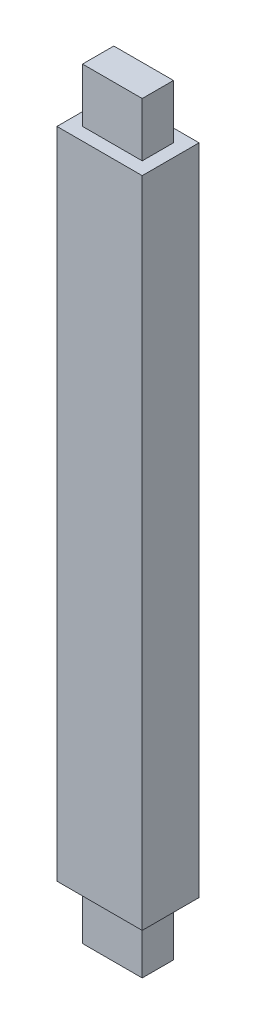
ISO-10303-21;
HEADER;
FILE_DESCRIPTION(('STEP AP214'),'2;1');
FILE_NAME('part.step','',(''),(''),'','','');
FILE_SCHEMA(('AUTOMOTIVE_DESIGN { 1 0 10303 214 1 1 1 1 }'));
ENDSEC;
DATA;
#1=APPLICATION_CONTEXT('core data for automotive mechanical design processes');
#2=APPLICATION_PROTOCOL_DEFINITION('international standard','automotive_design',2000,#1);
#3=PRODUCT_CONTEXT('',#1,'mechanical');
#4=PRODUCT('Part','Part','',(#3));
#5=PRODUCT_RELATED_PRODUCT_CATEGORY('part','',(#4));
#6=PRODUCT_DEFINITION_FORMATION('','',#4);
#7=PRODUCT_DEFINITION_CONTEXT('part definition',#1,'design');
#8=PRODUCT_DEFINITION('design','',#6,#7);
#9=PRODUCT_DEFINITION_SHAPE('','',#8);
#10=(LENGTH_UNIT() NAMED_UNIT(*) SI_UNIT(.MILLI.,.METRE.));
#11=(NAMED_UNIT(*) PLANE_ANGLE_UNIT() SI_UNIT($,.RADIAN.));
#12=(NAMED_UNIT(*) SI_UNIT($,.STERADIAN.) SOLID_ANGLE_UNIT());
#13=UNCERTAINTY_MEASURE_WITH_UNIT(LENGTH_MEASURE(1.E-05),#10,'distance_accuracy_value','');
#14=(GEOMETRIC_REPRESENTATION_CONTEXT(3) GLOBAL_UNCERTAINTY_ASSIGNED_CONTEXT((#13)) GLOBAL_UNIT_ASSIGNED_CONTEXT((#10,
#11,#12)) REPRESENTATION_CONTEXT('',''));
#15=CARTESIAN_POINT('',(0.,0.,0.));
#16=DIRECTION('',(0.,0.,1.));
#17=DIRECTION('',(1.,0.,0.));
#18=AXIS2_PLACEMENT_3D('',#15,#16,#17);
#19=CARTESIAN_POINT('',(7.5,57.5,-5.));
#20=DIRECTION('',(-1.,0.,0.));
#21=DIRECTION('',(0.,0.,1.));
#22=AXIS2_PLACEMENT_3D('',#19,#20,#21);
#23=PLANE('',#22);
#24=DIRECTION('',(0.,0.,-1.));
#25=VECTOR('',#24,1.);
#26=CARTESIAN_POINT('',(7.5,-57.5,-5.));
#27=LINE('',#26,#25);
#28=CARTESIAN_POINT('',(7.5,-57.5,5.));
#29=VERTEX_POINT('',#28);
#30=CARTESIAN_POINT('',(7.5,-57.5,-5.));
#31=VERTEX_POINT('',#30);
#32=EDGE_CURVE('E195',#29,#31,#27,.T.);
#33=ORIENTED_EDGE('',*,*,#32,.T.);
#34=DIRECTION('',(0.,-1.,0.));
#35=VECTOR('',#34,1.);
#36=CARTESIAN_POINT('',(7.5,57.5,-5.));
#37=LINE('',#36,#35);
#38=CARTESIAN_POINT('',(7.5,57.5,-5.));
#39=VERTEX_POINT('',#38);
#40=EDGE_CURVE('E11',#39,#31,#37,.T.);
#41=ORIENTED_EDGE('',*,*,#40,.F.);
#42=DIRECTION('',(0.,0.,-1.));
#43=VECTOR('',#42,1.);
#44=CARTESIAN_POINT('',(7.5,57.5,-5.));
#45=LINE('',#44,#43);
#46=CARTESIAN_POINT('',(7.5,57.5,5.));
#47=VERTEX_POINT('',#46);
#48=EDGE_CURVE('E196',#47,#39,#45,.T.);
#49=ORIENTED_EDGE('',*,*,#48,.F.);
#50=DIRECTION('',(0.,-1.,0.));
#51=VECTOR('',#50,1.);
#52=CARTESIAN_POINT('',(7.5,57.5,5.));
#53=LINE('',#52,#51);
#54=EDGE_CURVE('E206',#47,#29,#53,.T.);
#55=ORIENTED_EDGE('',*,*,#54,.T.);
#56=EDGE_LOOP('',(#33,#41,#49,#55));
#57=FACE_BOUND('',#56,.T.);
#58=ADVANCED_FACE('F39',(#57),#23,.F.);
#59=CARTESIAN_POINT('',(-7.5,57.5,-5.));
#60=DIRECTION('',(0.,0.,1.));
#61=DIRECTION('',(1.,0.,0.));
#62=AXIS2_PLACEMENT_3D('',#59,#60,#61);
#63=PLANE('',#62);
#64=DIRECTION('',(-1.,0.,0.));
#65=VECTOR('',#64,1.);
#66=CARTESIAN_POINT('',(-7.5,-57.5,-5.));
#67=LINE('',#66,#65);
#68=CARTESIAN_POINT('',(-7.5,-57.5,-5.));
#69=VERTEX_POINT('',#68);
#70=EDGE_CURVE('E209',#31,#69,#67,.T.);
#71=ORIENTED_EDGE('',*,*,#70,.T.);
#72=DIRECTION('',(0.,-1.,0.));
#73=VECTOR('',#72,1.);
#74=CARTESIAN_POINT('',(-7.5,57.5,-5.));
#75=LINE('',#74,#73);
#76=CARTESIAN_POINT('',(-7.5,57.5,-5.));
#77=VERTEX_POINT('',#76);
#78=EDGE_CURVE('E46',#77,#69,#75,.T.);
#79=ORIENTED_EDGE('',*,*,#78,.F.);
#80=DIRECTION('',(-1.,0.,0.));
#81=VECTOR('',#80,1.);
#82=CARTESIAN_POINT('',(-7.5,57.5,-5.));
#83=LINE('',#82,#81);
#84=EDGE_CURVE('E199',#39,#77,#83,.T.);
#85=ORIENTED_EDGE('',*,*,#84,.F.);
#86=ORIENTED_EDGE('',*,*,#40,.T.);
#87=EDGE_LOOP('',(#71,#79,#85,#86));
#88=FACE_BOUND('',#87,.T.);
#89=ADVANCED_FACE('F239',(#88),#63,.F.);
#90=CARTESIAN_POINT('',(-7.5,57.5,-5.));
#91=DIRECTION('',(1.,0.,0.));
#92=DIRECTION('',(0.,0.,-1.));
#93=AXIS2_PLACEMENT_3D('',#90,#91,#92);
#94=PLANE('',#93);
#95=DIRECTION('',(0.,0.,1.));
#96=VECTOR('',#95,1.);
#97=CARTESIAN_POINT('',(-7.5,-57.5,-5.));
#98=LINE('',#97,#96);
#99=CARTESIAN_POINT('',(-7.5,-57.5,5.));
#100=VERTEX_POINT('',#99);
#101=EDGE_CURVE('E211',#69,#100,#98,.T.);
#102=ORIENTED_EDGE('',*,*,#101,.T.);
#103=DIRECTION('',(0.,-1.,0.));
#104=VECTOR('',#103,1.);
#105=CARTESIAN_POINT('',(-7.5,57.5,5.));
#106=LINE('',#105,#104);
#107=CARTESIAN_POINT('',(-7.5,57.5,5.));
#108=VERTEX_POINT('',#107);
#109=EDGE_CURVE('E216',#108,#100,#106,.T.);
#110=ORIENTED_EDGE('',*,*,#109,.F.);
#111=DIRECTION('',(0.,0.,1.));
#112=VECTOR('',#111,1.);
#113=CARTESIAN_POINT('',(-7.5,57.5,-5.));
#114=LINE('',#113,#112);
#115=EDGE_CURVE('E202',#77,#108,#114,.T.);
#116=ORIENTED_EDGE('',*,*,#115,.F.);
#117=ORIENTED_EDGE('',*,*,#78,.T.);
#118=EDGE_LOOP('',(#102,#110,#116,#117));
#119=FACE_BOUND('',#118,.T.);
#120=ADVANCED_FACE('F223',(#119),#94,.F.);
#121=CARTESIAN_POINT('',(-7.5,57.5,5.));
#122=DIRECTION('',(0.,0.,-1.));
#123=DIRECTION('',(-1.,0.,0.));
#124=AXIS2_PLACEMENT_3D('',#121,#122,#123);
#125=PLANE('',#124);
#126=DIRECTION('',(1.,0.,0.));
#127=VECTOR('',#126,1.);
#128=CARTESIAN_POINT('',(-7.5,-57.5,5.));
#129=LINE('',#128,#127);
#130=EDGE_CURVE('E200',#100,#29,#129,.T.);
#131=ORIENTED_EDGE('',*,*,#130,.T.);
#132=ORIENTED_EDGE('',*,*,#54,.F.);
#133=DIRECTION('',(1.,0.,0.));
#134=VECTOR('',#133,1.);
#135=CARTESIAN_POINT('',(-7.5,57.5,5.));
#136=LINE('',#135,#134);
#137=EDGE_CURVE('E204',#108,#47,#136,.T.);
#138=ORIENTED_EDGE('',*,*,#137,.F.);
#139=ORIENTED_EDGE('',*,*,#109,.T.);
#140=EDGE_LOOP('',(#131,#132,#138,#139));
#141=FACE_BOUND('',#140,.T.);
#142=ADVANCED_FACE('F232',(#141),#125,.F.);
#143=CARTESIAN_POINT('',(0.,57.5,0.));
#144=DIRECTION('',(0.,1.,0.));
#145=DIRECTION('',(0.,0.,1.));
#146=AXIS2_PLACEMENT_3D('',#143,#144,#145);
#147=PLANE('',#146);
#148=DIRECTION('',(1.,0.,0.));
#149=VECTOR('',#148,1.);
#150=CARTESIAN_POINT('',(-5.25,57.5,2.75));
#151=LINE('',#150,#149);
#152=CARTESIAN_POINT('',(-5.25,57.5,2.75));
#153=VERTEX_POINT('',#152);
#154=CARTESIAN_POINT('',(5.25,57.5,2.75));
#155=VERTEX_POINT('',#154);
#156=EDGE_CURVE('E61',#153,#155,#151,.T.);
#157=ORIENTED_EDGE('',*,*,#156,.F.);
#158=DIRECTION('',(0.,0.,1.));
#159=VECTOR('',#158,1.);
#160=CARTESIAN_POINT('',(-5.25,57.5,-2.75));
#161=LINE('',#160,#159);
#162=CARTESIAN_POINT('',(-5.25,57.5,-2.75));
#163=VERTEX_POINT('',#162);
#164=EDGE_CURVE('E169',#163,#153,#161,.T.);
#165=ORIENTED_EDGE('',*,*,#164,.F.);
#166=DIRECTION('',(-1.,0.,0.));
#167=VECTOR('',#166,1.);
#168=CARTESIAN_POINT('',(5.25,57.5,-2.75));
#169=LINE('',#168,#167);
#170=CARTESIAN_POINT('',(5.25,57.5,-2.75));
#171=VERTEX_POINT('',#170);
#172=EDGE_CURVE('E180',#171,#163,#169,.T.);
#173=ORIENTED_EDGE('',*,*,#172,.F.);
#174=DIRECTION('',(0.,0.,-1.));
#175=VECTOR('',#174,1.);
#176=CARTESIAN_POINT('',(5.25,57.5,2.75));
#177=LINE('',#176,#175);
#178=EDGE_CURVE('E177',#155,#171,#177,.T.);
#179=ORIENTED_EDGE('',*,*,#178,.F.);
#180=EDGE_LOOP('',(#157,#165,#173,#179));
#181=FACE_BOUND('',#180,.T.);
#182=ORIENTED_EDGE('',*,*,#48,.T.);
#183=ORIENTED_EDGE('',*,*,#84,.T.);
#184=ORIENTED_EDGE('',*,*,#115,.T.);
#185=ORIENTED_EDGE('',*,*,#137,.T.);
#186=EDGE_LOOP('',(#182,#183,#184,#185));
#187=FACE_BOUND('',#186,.T.);
#188=ADVANCED_FACE('F238',(#181,#187),#147,.T.);
#189=CARTESIAN_POINT('',(0.,-57.5,0.));
#190=DIRECTION('',(0.,1.,0.));
#191=DIRECTION('',(0.,0.,1.));
#192=AXIS2_PLACEMENT_3D('',#189,#190,#191);
#193=PLANE('',#192);
#194=DIRECTION('',(0.,0.,1.));
#195=VECTOR('',#194,1.);
#196=CARTESIAN_POINT('',(-5.25,-57.5,-2.75));
#197=LINE('',#196,#195);
#198=CARTESIAN_POINT('',(-5.25,-57.5,-2.75));
#199=VERTEX_POINT('',#198);
#200=CARTESIAN_POINT('',(-5.25,-57.5,2.75));
#201=VERTEX_POINT('',#200);
#202=EDGE_CURVE('E154',#199,#201,#197,.T.);
#203=ORIENTED_EDGE('',*,*,#202,.T.);
#204=DIRECTION('',(1.,0.,0.));
#205=VECTOR('',#204,1.);
#206=CARTESIAN_POINT('',(-5.25,-57.5,2.75));
#207=LINE('',#206,#205);
#208=CARTESIAN_POINT('',(5.25,-57.5,2.75));
#209=VERTEX_POINT('',#208);
#210=EDGE_CURVE('E53',#201,#209,#207,.T.);
#211=ORIENTED_EDGE('',*,*,#210,.T.);
#212=DIRECTION('',(0.,0.,-1.));
#213=VECTOR('',#212,1.);
#214=CARTESIAN_POINT('',(5.25,-57.5,2.75));
#215=LINE('',#214,#213);
#216=CARTESIAN_POINT('',(5.25,-57.5,-2.75));
#217=VERTEX_POINT('',#216);
#218=EDGE_CURVE('E144',#209,#217,#215,.T.);
#219=ORIENTED_EDGE('',*,*,#218,.T.);
#220=DIRECTION('',(-1.,0.,0.));
#221=VECTOR('',#220,1.);
#222=CARTESIAN_POINT('',(5.25,-57.5,-2.75));
#223=LINE('',#222,#221);
#224=EDGE_CURVE('E156',#217,#199,#223,.T.);
#225=ORIENTED_EDGE('',*,*,#224,.T.);
#226=EDGE_LOOP('',(#203,#211,#219,#225));
#227=FACE_BOUND('',#226,.T.);
#228=ORIENTED_EDGE('',*,*,#32,.F.);
#229=ORIENTED_EDGE('',*,*,#130,.F.);
#230=ORIENTED_EDGE('',*,*,#101,.F.);
#231=ORIENTED_EDGE('',*,*,#70,.F.);
#232=EDGE_LOOP('',(#228,#229,#230,#231));
#233=FACE_BOUND('',#232,.T.);
#234=ADVANCED_FACE('F229',(#227,#233),#193,.F.);
#235=CARTESIAN_POINT('',(-5.25,67.,2.75));
#236=DIRECTION('',(0.,0.,-1.));
#237=DIRECTION('',(-1.,0.,0.));
#238=AXIS2_PLACEMENT_3D('',#235,#236,#237);
#239=PLANE('',#238);
#240=ORIENTED_EDGE('',*,*,#156,.T.);
#241=DIRECTION('',(0.,-1.,0.));
#242=VECTOR('',#241,1.);
#243=CARTESIAN_POINT('',(5.25,67.,2.75));
#244=LINE('',#243,#242);
#245=CARTESIAN_POINT('',(5.25,67.,2.75));
#246=VERTEX_POINT('',#245);
#247=EDGE_CURVE('E192',#246,#155,#244,.T.);
#248=ORIENTED_EDGE('',*,*,#247,.F.);
#249=DIRECTION('',(1.,0.,0.));
#250=VECTOR('',#249,1.);
#251=CARTESIAN_POINT('',(-5.25,67.,2.75));
#252=LINE('',#251,#250);
#253=CARTESIAN_POINT('',(-5.25,67.,2.75));
#254=VERTEX_POINT('',#253);
#255=EDGE_CURVE('E165',#254,#246,#252,.T.);
#256=ORIENTED_EDGE('',*,*,#255,.F.);
#257=DIRECTION('',(0.,-1.,0.));
#258=VECTOR('',#257,1.);
#259=CARTESIAN_POINT('',(-5.25,67.,2.75));
#260=LINE('',#259,#258);
#261=EDGE_CURVE('E175',#254,#153,#260,.T.);
#262=ORIENTED_EDGE('',*,*,#261,.T.);
#263=EDGE_LOOP('',(#240,#248,#256,#262));
#264=FACE_BOUND('',#263,.T.);
#265=ADVANCED_FACE('F251',(#264),#239,.F.);
#266=CARTESIAN_POINT('',(5.25,67.,2.75));
#267=DIRECTION('',(-1.,0.,0.));
#268=DIRECTION('',(0.,0.,1.));
#269=AXIS2_PLACEMENT_3D('',#266,#267,#268);
#270=PLANE('',#269);
#271=ORIENTED_EDGE('',*,*,#178,.T.);
#272=DIRECTION('',(0.,-1.,0.));
#273=VECTOR('',#272,1.);
#274=CARTESIAN_POINT('',(5.25,67.,-2.75));
#275=LINE('',#274,#273);
#276=CARTESIAN_POINT('',(5.25,67.,-2.75));
#277=VERTEX_POINT('',#276);
#278=EDGE_CURVE('E189',#277,#171,#275,.T.);
#279=ORIENTED_EDGE('',*,*,#278,.F.);
#280=DIRECTION('',(0.,0.,-1.));
#281=VECTOR('',#280,1.);
#282=CARTESIAN_POINT('',(5.25,67.,2.75));
#283=LINE('',#282,#281);
#284=EDGE_CURVE('E168',#246,#277,#283,.T.);
#285=ORIENTED_EDGE('',*,*,#284,.F.);
#286=ORIENTED_EDGE('',*,*,#247,.T.);
#287=EDGE_LOOP('',(#271,#279,#285,#286));
#288=FACE_BOUND('',#287,.T.);
#289=ADVANCED_FACE('F257',(#288),#270,.F.);
#290=CARTESIAN_POINT('',(5.25,67.,-2.75));
#291=DIRECTION('',(0.,0.,1.));
#292=DIRECTION('',(1.,0.,0.));
#293=AXIS2_PLACEMENT_3D('',#290,#291,#292);
#294=PLANE('',#293);
#295=ORIENTED_EDGE('',*,*,#172,.T.);
#296=DIRECTION('',(0.,-1.,0.));
#297=VECTOR('',#296,1.);
#298=CARTESIAN_POINT('',(-5.25,67.,-2.75));
#299=LINE('',#298,#297);
#300=CARTESIAN_POINT('',(-5.25,67.,-2.75));
#301=VERTEX_POINT('',#300);
#302=EDGE_CURVE('E186',#301,#163,#299,.T.);
#303=ORIENTED_EDGE('',*,*,#302,.F.);
#304=DIRECTION('',(-1.,0.,0.));
#305=VECTOR('',#304,1.);
#306=CARTESIAN_POINT('',(5.25,67.,-2.75));
#307=LINE('',#306,#305);
#308=EDGE_CURVE('E171',#277,#301,#307,.T.);
#309=ORIENTED_EDGE('',*,*,#308,.F.);
#310=ORIENTED_EDGE('',*,*,#278,.T.);
#311=EDGE_LOOP('',(#295,#303,#309,#310));
#312=FACE_BOUND('',#311,.T.);
#313=ADVANCED_FACE('F261',(#312),#294,.F.);
#314=CARTESIAN_POINT('',(-5.25,67.,-2.75));
#315=DIRECTION('',(1.,0.,0.));
#316=DIRECTION('',(0.,0.,-1.));
#317=AXIS2_PLACEMENT_3D('',#314,#315,#316);
#318=PLANE('',#317);
#319=ORIENTED_EDGE('',*,*,#164,.T.);
#320=ORIENTED_EDGE('',*,*,#261,.F.);
#321=DIRECTION('',(0.,0.,1.));
#322=VECTOR('',#321,1.);
#323=CARTESIAN_POINT('',(-5.25,67.,-2.75));
#324=LINE('',#323,#322);
#325=EDGE_CURVE('E173',#301,#254,#324,.T.);
#326=ORIENTED_EDGE('',*,*,#325,.F.);
#327=ORIENTED_EDGE('',*,*,#302,.T.);
#328=EDGE_LOOP('',(#319,#320,#326,#327));
#329=FACE_BOUND('',#328,.T.);
#330=ADVANCED_FACE('F265',(#329),#318,.F.);
#331=CARTESIAN_POINT('',(0.,67.,0.));
#332=DIRECTION('',(0.,1.,0.));
#333=DIRECTION('',(0.,0.,1.));
#334=AXIS2_PLACEMENT_3D('',#331,#332,#333);
#335=PLANE('',#334);
#336=ORIENTED_EDGE('',*,*,#255,.T.);
#337=ORIENTED_EDGE('',*,*,#284,.T.);
#338=ORIENTED_EDGE('',*,*,#308,.T.);
#339=ORIENTED_EDGE('',*,*,#325,.T.);
#340=EDGE_LOOP('',(#336,#337,#338,#339));
#341=FACE_BOUND('',#340,.T.);
#342=ADVANCED_FACE('F269',(#341),#335,.T.);
#343=CARTESIAN_POINT('',(-5.25,-67.,2.75));
#344=DIRECTION('',(0.,0.,1.));
#345=DIRECTION('',(1.,0.,0.));
#346=AXIS2_PLACEMENT_3D('',#343,#344,#345);
#347=PLANE('',#346);
#348=ORIENTED_EDGE('',*,*,#210,.F.);
#349=DIRECTION('',(0.,1.,0.));
#350=VECTOR('',#349,1.);
#351=CARTESIAN_POINT('',(-5.25,-67.,2.75));
#352=LINE('',#351,#350);
#353=CARTESIAN_POINT('',(-5.25,-67.,2.75));
#354=VERTEX_POINT('',#353);
#355=EDGE_CURVE('E125',#354,#201,#352,.T.);
#356=ORIENTED_EDGE('',*,*,#355,.F.);
#357=DIRECTION('',(1.,0.,0.));
#358=VECTOR('',#357,1.);
#359=CARTESIAN_POINT('',(-5.25,-67.,2.75));
#360=LINE('',#359,#358);
#361=CARTESIAN_POINT('',(5.25,-67.,2.75));
#362=VERTEX_POINT('',#361);
#363=EDGE_CURVE('E128',#354,#362,#360,.T.);
#364=ORIENTED_EDGE('',*,*,#363,.T.);
#365=DIRECTION('',(0.,1.,0.));
#366=VECTOR('',#365,1.);
#367=CARTESIAN_POINT('',(5.25,-67.,2.75));
#368=LINE('',#367,#366);
#369=EDGE_CURVE('E152',#362,#209,#368,.T.);
#370=ORIENTED_EDGE('',*,*,#369,.T.);
#371=EDGE_LOOP('',(#348,#356,#364,#370));
#372=FACE_BOUND('',#371,.T.);
#373=ADVANCED_FACE('F127',(#372),#347,.T.);
#374=CARTESIAN_POINT('',(-5.25,-67.,-2.75));
#375=DIRECTION('',(-1.,0.,0.));
#376=DIRECTION('',(0.,0.,1.));
#377=AXIS2_PLACEMENT_3D('',#374,#375,#376);
#378=PLANE('',#377);
#379=ORIENTED_EDGE('',*,*,#202,.F.);
#380=DIRECTION('',(0.,1.,0.));
#381=VECTOR('',#380,1.);
#382=CARTESIAN_POINT('',(-5.25,-67.,-2.75));
#383=LINE('',#382,#381);
#384=CARTESIAN_POINT('',(-5.25,-67.,-2.75));
#385=VERTEX_POINT('',#384);
#386=EDGE_CURVE('E134',#385,#199,#383,.T.);
#387=ORIENTED_EDGE('',*,*,#386,.F.);
#388=DIRECTION('',(0.,0.,1.));
#389=VECTOR('',#388,1.);
#390=CARTESIAN_POINT('',(-5.25,-67.,-2.75));
#391=LINE('',#390,#389);
#392=EDGE_CURVE('E140',#385,#354,#391,.T.);
#393=ORIENTED_EDGE('',*,*,#392,.T.);
#394=ORIENTED_EDGE('',*,*,#355,.T.);
#395=EDGE_LOOP('',(#379,#387,#393,#394));
#396=FACE_BOUND('',#395,.T.);
#397=ADVANCED_FACE('F146',(#396),#378,.T.);
#398=CARTESIAN_POINT('',(5.25,-67.,-2.75));
#399=DIRECTION('',(0.,0.,-1.));
#400=DIRECTION('',(-1.,0.,0.));
#401=AXIS2_PLACEMENT_3D('',#398,#399,#400);
#402=PLANE('',#401);
#403=ORIENTED_EDGE('',*,*,#224,.F.);
#404=DIRECTION('',(0.,1.,0.));
#405=VECTOR('',#404,1.);
#406=CARTESIAN_POINT('',(5.25,-67.,-2.75));
#407=LINE('',#406,#405);
#408=CARTESIAN_POINT('',(5.25,-67.,-2.75));
#409=VERTEX_POINT('',#408);
#410=EDGE_CURVE('E162',#409,#217,#407,.T.);
#411=ORIENTED_EDGE('',*,*,#410,.F.);
#412=DIRECTION('',(-1.,0.,0.));
#413=VECTOR('',#412,1.);
#414=CARTESIAN_POINT('',(5.25,-67.,-2.75));
#415=LINE('',#414,#413);
#416=EDGE_CURVE('E147',#409,#385,#415,.T.);
#417=ORIENTED_EDGE('',*,*,#416,.T.);
#418=ORIENTED_EDGE('',*,*,#386,.T.);
#419=EDGE_LOOP('',(#403,#411,#417,#418));
#420=FACE_BOUND('',#419,.T.);
#421=ADVANCED_FACE('F278',(#420),#402,.T.);
#422=CARTESIAN_POINT('',(5.25,-67.,2.75));
#423=DIRECTION('',(1.,0.,0.));
#424=DIRECTION('',(0.,0.,-1.));
#425=AXIS2_PLACEMENT_3D('',#422,#423,#424);
#426=PLANE('',#425);
#427=ORIENTED_EDGE('',*,*,#218,.F.);
#428=ORIENTED_EDGE('',*,*,#369,.F.);
#429=DIRECTION('',(0.,0.,-1.));
#430=VECTOR('',#429,1.);
#431=CARTESIAN_POINT('',(5.25,-67.,2.75));
#432=LINE('',#431,#430);
#433=EDGE_CURVE('E143',#362,#409,#432,.T.);
#434=ORIENTED_EDGE('',*,*,#433,.T.);
#435=ORIENTED_EDGE('',*,*,#410,.T.);
#436=EDGE_LOOP('',(#427,#428,#434,#435));
#437=FACE_BOUND('',#436,.T.);
#438=ADVANCED_FACE('F281',(#437),#426,.T.);
#439=CARTESIAN_POINT('',(0.,-67.,0.));
#440=DIRECTION('',(0.,-1.,0.));
#441=DIRECTION('',(0.,0.,1.));
#442=AXIS2_PLACEMENT_3D('',#439,#440,#441);
#443=PLANE('',#442);
#444=ORIENTED_EDGE('',*,*,#363,.F.);
#445=ORIENTED_EDGE('',*,*,#392,.F.);
#446=ORIENTED_EDGE('',*,*,#416,.F.);
#447=ORIENTED_EDGE('',*,*,#433,.F.);
#448=EDGE_LOOP('',(#444,#445,#446,#447));
#449=FACE_BOUND('',#448,.T.);
#450=ADVANCED_FACE('F138',(#449),#443,.T.);
#451=CLOSED_SHELL('',(#58,#89,#120,#142,#188,#234,#265,#289,#313,#330,#342,#373,#397,#421,#438,#450));
#452=MANIFOLD_SOLID_BREP('B2',#451);
#453=ADVANCED_BREP_SHAPE_REPRESENTATION('',(#18,#452),#14);
#454=SHAPE_DEFINITION_REPRESENTATION(#9,#453);
ENDSEC;
END-ISO-10303-21;
